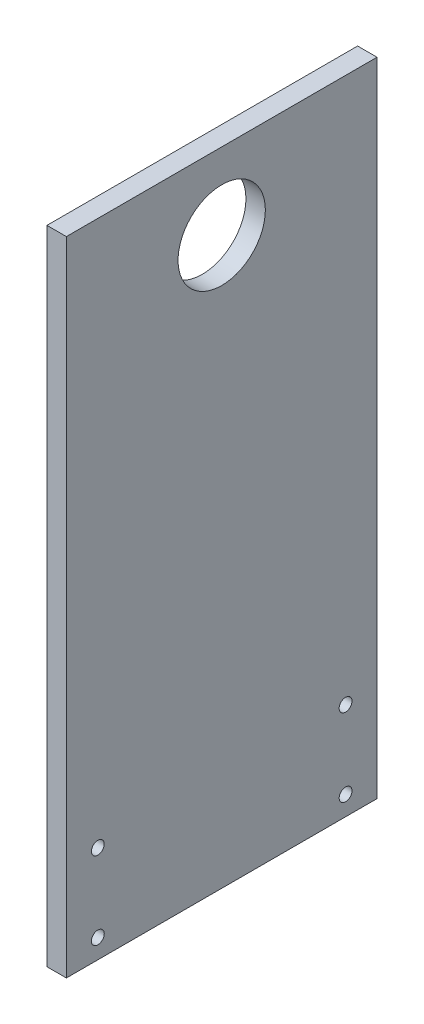
ISO-10303-21;
HEADER;
FILE_DESCRIPTION(('STEP AP214'),'2;1');
FILE_NAME('part.step','',(''),(''),'','','');
FILE_SCHEMA(('AUTOMOTIVE_DESIGN { 1 0 10303 214 1 1 1 1 }'));
ENDSEC;
DATA;
#1=APPLICATION_CONTEXT('core data for automotive mechanical design processes');
#2=APPLICATION_PROTOCOL_DEFINITION('international standard','automotive_design',2000,#1);
#3=PRODUCT_CONTEXT('',#1,'mechanical');
#4=PRODUCT('Part','Part','',(#3));
#5=PRODUCT_RELATED_PRODUCT_CATEGORY('part','',(#4));
#6=PRODUCT_DEFINITION_FORMATION('','',#4);
#7=PRODUCT_DEFINITION_CONTEXT('part definition',#1,'design');
#8=PRODUCT_DEFINITION('design','',#6,#7);
#9=PRODUCT_DEFINITION_SHAPE('','',#8);
#10=(LENGTH_UNIT() NAMED_UNIT(*) SI_UNIT(.MILLI.,.METRE.));
#11=(NAMED_UNIT(*) PLANE_ANGLE_UNIT() SI_UNIT($,.RADIAN.));
#12=(NAMED_UNIT(*) SI_UNIT($,.STERADIAN.) SOLID_ANGLE_UNIT());
#13=UNCERTAINTY_MEASURE_WITH_UNIT(LENGTH_MEASURE(1.E-05),#10,'distance_accuracy_value','');
#14=(GEOMETRIC_REPRESENTATION_CONTEXT(3) GLOBAL_UNCERTAINTY_ASSIGNED_CONTEXT((#13)) GLOBAL_UNIT_ASSIGNED_CONTEXT((#10,
#11,#12)) REPRESENTATION_CONTEXT('',''));
#15=CARTESIAN_POINT('',(0.,0.,0.));
#16=DIRECTION('',(0.,0.,1.));
#17=DIRECTION('',(1.,0.,0.));
#18=AXIS2_PLACEMENT_3D('',#15,#16,#17);
#19=CARTESIAN_POINT('',(6.35,0.,0.));
#20=DIRECTION('',(1.,0.,0.));
#21=DIRECTION('',(0.,0.,-1.));
#22=AXIS2_PLACEMENT_3D('',#19,#20,#21);
#23=PLANE('',#22);
#24=CARTESIAN_POINT('',(6.35,-73.25,-40.513));
#25=DIRECTION('',(1.,0.,0.));
#26=DIRECTION('',(0.,0.,-1.));
#27=AXIS2_PLACEMENT_3D('',#24,#25,#26);
#28=CIRCLE('',#27,2.1);
#29=CARTESIAN_POINT('',(6.35,-73.25,-42.613));
#30=VERTEX_POINT('',#29);
#31=EDGE_CURVE('E130',#30,#30,#28,.T.);
#32=ORIENTED_EDGE('',*,*,#31,.F.);
#33=EDGE_LOOP('',(#32));
#34=FACE_BOUND('',#33,.T.);
#35=CARTESIAN_POINT('',(6.35,-98.65,-40.513));
#36=DIRECTION('',(1.,0.,0.));
#37=DIRECTION('',(0.,0.,-1.));
#38=AXIS2_PLACEMENT_3D('',#35,#36,#37);
#39=CIRCLE('',#38,2.1);
#40=CARTESIAN_POINT('',(6.35,-98.65,-42.613));
#41=VERTEX_POINT('',#40);
#42=EDGE_CURVE('E118',#41,#41,#39,.T.);
#43=ORIENTED_EDGE('',*,*,#42,.F.);
#44=EDGE_LOOP('',(#43));
#45=FACE_BOUND('',#44,.T.);
#46=DIRECTION('',(0.,1.,0.));
#47=VECTOR('',#46,1.);
#48=CARTESIAN_POINT('',(6.35,105.,-50.8));
#49=LINE('',#48,#47);
#50=CARTESIAN_POINT('',(6.35,-105.,-50.8));
#51=VERTEX_POINT('',#50);
#52=CARTESIAN_POINT('',(6.35,105.,-50.8));
#53=VERTEX_POINT('',#52);
#54=EDGE_CURVE('E88',#51,#53,#49,.T.);
#55=ORIENTED_EDGE('',*,*,#54,.T.);
#56=DIRECTION('',(0.,0.,1.));
#57=VECTOR('',#56,1.);
#58=CARTESIAN_POINT('',(6.35,105.,50.8));
#59=LINE('',#58,#57);
#60=CARTESIAN_POINT('',(6.35,105.,50.8));
#61=VERTEX_POINT('',#60);
#62=EDGE_CURVE('E83',#53,#61,#59,.T.);
#63=ORIENTED_EDGE('',*,*,#62,.T.);
#64=DIRECTION('',(0.,-1.,0.));
#65=VECTOR('',#64,1.);
#66=CARTESIAN_POINT('',(6.35,105.,50.8));
#67=LINE('',#66,#65);
#68=CARTESIAN_POINT('',(6.35,-105.,50.8));
#69=VERTEX_POINT('',#68);
#70=EDGE_CURVE('E86',#61,#69,#67,.T.);
#71=ORIENTED_EDGE('',*,*,#70,.T.);
#72=DIRECTION('',(0.,0.,-1.));
#73=VECTOR('',#72,1.);
#74=CARTESIAN_POINT('',(6.35,-105.,50.8));
#75=LINE('',#74,#73);
#76=EDGE_CURVE('E53',#69,#51,#75,.T.);
#77=ORIENTED_EDGE('',*,*,#76,.T.);
#78=EDGE_LOOP('',(#55,#63,#71,#77));
#79=FACE_BOUND('',#78,.T.);
#80=CARTESIAN_POINT('',(6.35,-98.65,40.513));
#81=DIRECTION('',(1.,0.,0.));
#82=DIRECTION('',(0.,0.,-1.));
#83=AXIS2_PLACEMENT_3D('',#80,#81,#82);
#84=CIRCLE('',#83,2.1);
#85=CARTESIAN_POINT('',(6.35,-98.65,38.413));
#86=VERTEX_POINT('',#85);
#87=EDGE_CURVE('E103',#86,#86,#84,.T.);
#88=ORIENTED_EDGE('',*,*,#87,.F.);
#89=EDGE_LOOP('',(#88));
#90=FACE_BOUND('',#89,.T.);
#91=CARTESIAN_POINT('',(6.35,-73.25,40.513));
#92=DIRECTION('',(1.,0.,0.));
#93=DIRECTION('',(0.,0.,-1.));
#94=AXIS2_PLACEMENT_3D('',#91,#92,#93);
#95=CIRCLE('',#94,2.1);
#96=CARTESIAN_POINT('',(6.35,-73.25,38.413));
#97=VERTEX_POINT('',#96);
#98=EDGE_CURVE('E124',#97,#97,#95,.T.);
#99=ORIENTED_EDGE('',*,*,#98,.F.);
#100=EDGE_LOOP('',(#99));
#101=FACE_BOUND('',#100,.T.);
#102=CARTESIAN_POINT('',(6.35,80.,0.));
#103=DIRECTION('',(1.,0.,0.));
#104=DIRECTION('',(0.,0.,-1.));
#105=AXIS2_PLACEMENT_3D('',#102,#103,#104);
#106=CIRCLE('',#105,14.275);
#107=CARTESIAN_POINT('',(6.35,80.,-14.275));
#108=VERTEX_POINT('',#107);
#109=EDGE_CURVE('E136',#108,#108,#106,.T.);
#110=ORIENTED_EDGE('',*,*,#109,.F.);
#111=EDGE_LOOP('',(#110));
#112=FACE_BOUND('',#111,.T.);
#113=ADVANCED_FACE('F36',(#34,#45,#79,#90,#101,#112),#23,.T.);
#114=CARTESIAN_POINT('',(0.,0.,0.));
#115=DIRECTION('',(1.,0.,0.));
#116=DIRECTION('',(0.,0.,-1.));
#117=AXIS2_PLACEMENT_3D('',#114,#115,#116);
#118=PLANE('',#117);
#119=DIRECTION('',(0.,1.,0.));
#120=VECTOR('',#119,1.);
#121=CARTESIAN_POINT('',(0.,105.,-50.8));
#122=LINE('',#121,#120);
#123=CARTESIAN_POINT('',(0.,-105.,-50.8));
#124=VERTEX_POINT('',#123);
#125=CARTESIAN_POINT('',(0.,105.,-50.8));
#126=VERTEX_POINT('',#125);
#127=EDGE_CURVE('E100',#124,#126,#122,.T.);
#128=ORIENTED_EDGE('',*,*,#127,.F.);
#129=DIRECTION('',(0.,0.,-1.));
#130=VECTOR('',#129,1.);
#131=CARTESIAN_POINT('',(0.,-105.,50.8));
#132=LINE('',#131,#130);
#133=CARTESIAN_POINT('',(0.,-105.,50.8));
#134=VERTEX_POINT('',#133);
#135=EDGE_CURVE('E76',#134,#124,#132,.T.);
#136=ORIENTED_EDGE('',*,*,#135,.F.);
#137=DIRECTION('',(0.,-1.,0.));
#138=VECTOR('',#137,1.);
#139=CARTESIAN_POINT('',(0.,105.,50.8));
#140=LINE('',#139,#138);
#141=CARTESIAN_POINT('',(0.,105.,50.8));
#142=VERTEX_POINT('',#141);
#143=EDGE_CURVE('E70',#142,#134,#140,.T.);
#144=ORIENTED_EDGE('',*,*,#143,.F.);
#145=DIRECTION('',(0.,0.,1.));
#146=VECTOR('',#145,1.);
#147=CARTESIAN_POINT('',(0.,105.,50.8));
#148=LINE('',#147,#146);
#149=EDGE_CURVE('E92',#126,#142,#148,.T.);
#150=ORIENTED_EDGE('',*,*,#149,.F.);
#151=EDGE_LOOP('',(#128,#136,#144,#150));
#152=FACE_BOUND('',#151,.T.);
#153=CARTESIAN_POINT('',(0.,-98.65,40.513));
#154=DIRECTION('',(1.,0.,0.));
#155=DIRECTION('',(0.,0.,-1.));
#156=AXIS2_PLACEMENT_3D('',#153,#154,#155);
#157=CIRCLE('',#156,2.1);
#158=CARTESIAN_POINT('',(0.,-98.65,38.413));
#159=VERTEX_POINT('',#158);
#160=EDGE_CURVE('E115',#159,#159,#157,.T.);
#161=ORIENTED_EDGE('',*,*,#160,.T.);
#162=EDGE_LOOP('',(#161));
#163=FACE_BOUND('',#162,.T.);
#164=CARTESIAN_POINT('',(0.,-98.65,-40.513));
#165=DIRECTION('',(1.,0.,0.));
#166=DIRECTION('',(0.,0.,-1.));
#167=AXIS2_PLACEMENT_3D('',#164,#165,#166);
#168=CIRCLE('',#167,2.1);
#169=CARTESIAN_POINT('',(0.,-98.65,-42.613));
#170=VERTEX_POINT('',#169);
#171=EDGE_CURVE('E121',#170,#170,#168,.T.);
#172=ORIENTED_EDGE('',*,*,#171,.T.);
#173=EDGE_LOOP('',(#172));
#174=FACE_BOUND('',#173,.T.);
#175=CARTESIAN_POINT('',(0.,-73.25,40.513));
#176=DIRECTION('',(1.,0.,0.));
#177=DIRECTION('',(0.,0.,-1.));
#178=AXIS2_PLACEMENT_3D('',#175,#176,#177);
#179=CIRCLE('',#178,2.1);
#180=CARTESIAN_POINT('',(0.,-73.25,38.413));
#181=VERTEX_POINT('',#180);
#182=EDGE_CURVE('E127',#181,#181,#179,.T.);
#183=ORIENTED_EDGE('',*,*,#182,.T.);
#184=EDGE_LOOP('',(#183));
#185=FACE_BOUND('',#184,.T.);
#186=CARTESIAN_POINT('',(0.,-73.25,-40.513));
#187=DIRECTION('',(1.,0.,0.));
#188=DIRECTION('',(0.,0.,-1.));
#189=AXIS2_PLACEMENT_3D('',#186,#187,#188);
#190=CIRCLE('',#189,2.1);
#191=CARTESIAN_POINT('',(0.,-73.25,-42.613));
#192=VERTEX_POINT('',#191);
#193=EDGE_CURVE('E133',#192,#192,#190,.T.);
#194=ORIENTED_EDGE('',*,*,#193,.T.);
#195=EDGE_LOOP('',(#194));
#196=FACE_BOUND('',#195,.T.);
#197=CARTESIAN_POINT('',(0.,80.,0.));
#198=DIRECTION('',(1.,0.,0.));
#199=DIRECTION('',(0.,0.,-1.));
#200=AXIS2_PLACEMENT_3D('',#197,#198,#199);
#201=CIRCLE('',#200,14.275);
#202=CARTESIAN_POINT('',(0.,80.,-14.275));
#203=VERTEX_POINT('',#202);
#204=EDGE_CURVE('E139',#203,#203,#201,.T.);
#205=ORIENTED_EDGE('',*,*,#204,.T.);
#206=EDGE_LOOP('',(#205));
#207=FACE_BOUND('',#206,.T.);
#208=ADVANCED_FACE('F111',(#152,#163,#174,#185,#196,#207),#118,.F.);
#209=CARTESIAN_POINT('',(6.35,105.,-50.8));
#210=DIRECTION('',(0.,0.,1.));
#211=DIRECTION('',(0.,-1.,0.));
#212=AXIS2_PLACEMENT_3D('',#209,#210,#211);
#213=PLANE('',#212);
#214=ORIENTED_EDGE('',*,*,#127,.T.);
#215=DIRECTION('',(-1.,0.,0.));
#216=VECTOR('',#215,1.);
#217=CARTESIAN_POINT('',(6.35,105.,-50.8));
#218=LINE('',#217,#216);
#219=EDGE_CURVE('E11',#53,#126,#218,.T.);
#220=ORIENTED_EDGE('',*,*,#219,.F.);
#221=ORIENTED_EDGE('',*,*,#54,.F.);
#222=DIRECTION('',(-1.,0.,0.));
#223=VECTOR('',#222,1.);
#224=CARTESIAN_POINT('',(6.35,-105.,-50.8));
#225=LINE('',#224,#223);
#226=EDGE_CURVE('E96',#51,#124,#225,.T.);
#227=ORIENTED_EDGE('',*,*,#226,.T.);
#228=EDGE_LOOP('',(#214,#220,#221,#227));
#229=FACE_BOUND('',#228,.T.);
#230=ADVANCED_FACE('F38',(#229),#213,.F.);
#231=CARTESIAN_POINT('',(6.35,105.,50.8));
#232=DIRECTION('',(0.,-1.,0.));
#233=DIRECTION('',(0.,0.,-1.));
#234=AXIS2_PLACEMENT_3D('',#231,#232,#233);
#235=PLANE('',#234);
#236=ORIENTED_EDGE('',*,*,#149,.T.);
#237=DIRECTION('',(-1.,0.,0.));
#238=VECTOR('',#237,1.);
#239=CARTESIAN_POINT('',(6.35,105.,50.8));
#240=LINE('',#239,#238);
#241=EDGE_CURVE('E45',#61,#142,#240,.T.);
#242=ORIENTED_EDGE('',*,*,#241,.F.);
#243=ORIENTED_EDGE('',*,*,#62,.F.);
#244=ORIENTED_EDGE('',*,*,#219,.T.);
#245=EDGE_LOOP('',(#236,#242,#243,#244));
#246=FACE_BOUND('',#245,.T.);
#247=ADVANCED_FACE('F91',(#246),#235,.F.);
#248=CARTESIAN_POINT('',(6.35,105.,50.8));
#249=DIRECTION('',(0.,0.,-1.));
#250=DIRECTION('',(0.,1.,0.));
#251=AXIS2_PLACEMENT_3D('',#248,#249,#250);
#252=PLANE('',#251);
#253=ORIENTED_EDGE('',*,*,#143,.T.);
#254=DIRECTION('',(-1.,0.,0.));
#255=VECTOR('',#254,1.);
#256=CARTESIAN_POINT('',(6.35,-105.,50.8));
#257=LINE('',#256,#255);
#258=EDGE_CURVE('E93',#69,#134,#257,.T.);
#259=ORIENTED_EDGE('',*,*,#258,.F.);
#260=ORIENTED_EDGE('',*,*,#70,.F.);
#261=ORIENTED_EDGE('',*,*,#241,.T.);
#262=EDGE_LOOP('',(#253,#259,#260,#261));
#263=FACE_BOUND('',#262,.T.);
#264=ADVANCED_FACE('F94',(#263),#252,.F.);
#265=CARTESIAN_POINT('',(6.35,-105.,50.8));
#266=DIRECTION('',(0.,1.,0.));
#267=DIRECTION('',(0.,0.,1.));
#268=AXIS2_PLACEMENT_3D('',#265,#266,#267);
#269=PLANE('',#268);
#270=ORIENTED_EDGE('',*,*,#135,.T.);
#271=ORIENTED_EDGE('',*,*,#226,.F.);
#272=ORIENTED_EDGE('',*,*,#76,.F.);
#273=ORIENTED_EDGE('',*,*,#258,.T.);
#274=EDGE_LOOP('',(#270,#271,#272,#273));
#275=FACE_BOUND('',#274,.T.);
#276=ADVANCED_FACE('F108',(#275),#269,.F.);
#277=CARTESIAN_POINT('',(6.35,-98.65,40.513));
#278=DIRECTION('',(-1.,0.,0.));
#279=DIRECTION('',(0.,0.,1.));
#280=AXIS2_PLACEMENT_3D('',#277,#278,#279);
#281=CYLINDRICAL_SURFACE('',#280,2.1);
#282=ORIENTED_EDGE('',*,*,#87,.T.);
#283=EDGE_LOOP('',(#282));
#284=FACE_BOUND('',#283,.T.);
#285=ORIENTED_EDGE('',*,*,#160,.F.);
#286=EDGE_LOOP('',(#285));
#287=FACE_BOUND('',#286,.T.);
#288=ADVANCED_FACE('F158',(#284,#287),#281,.F.);
#289=CARTESIAN_POINT('',(6.35,-98.65,-40.513));
#290=DIRECTION('',(-1.,0.,0.));
#291=DIRECTION('',(0.,0.,1.));
#292=AXIS2_PLACEMENT_3D('',#289,#290,#291);
#293=CYLINDRICAL_SURFACE('',#292,2.1);
#294=ORIENTED_EDGE('',*,*,#42,.T.);
#295=EDGE_LOOP('',(#294));
#296=FACE_BOUND('',#295,.T.);
#297=ORIENTED_EDGE('',*,*,#171,.F.);
#298=EDGE_LOOP('',(#297));
#299=FACE_BOUND('',#298,.T.);
#300=ADVANCED_FACE('F204',(#296,#299),#293,.F.);
#301=CARTESIAN_POINT('',(6.35,-73.25,40.513));
#302=DIRECTION('',(-1.,0.,0.));
#303=DIRECTION('',(0.,0.,1.));
#304=AXIS2_PLACEMENT_3D('',#301,#302,#303);
#305=CYLINDRICAL_SURFACE('',#304,2.1);
#306=ORIENTED_EDGE('',*,*,#98,.T.);
#307=EDGE_LOOP('',(#306));
#308=FACE_BOUND('',#307,.T.);
#309=ORIENTED_EDGE('',*,*,#182,.F.);
#310=EDGE_LOOP('',(#309));
#311=FACE_BOUND('',#310,.T.);
#312=ADVANCED_FACE('F212',(#308,#311),#305,.F.);
#313=CARTESIAN_POINT('',(6.35,-73.25,-40.513));
#314=DIRECTION('',(-1.,0.,0.));
#315=DIRECTION('',(0.,0.,1.));
#316=AXIS2_PLACEMENT_3D('',#313,#314,#315);
#317=CYLINDRICAL_SURFACE('',#316,2.1);
#318=ORIENTED_EDGE('',*,*,#31,.T.);
#319=EDGE_LOOP('',(#318));
#320=FACE_BOUND('',#319,.T.);
#321=ORIENTED_EDGE('',*,*,#193,.F.);
#322=EDGE_LOOP('',(#321));
#323=FACE_BOUND('',#322,.T.);
#324=ADVANCED_FACE('F220',(#320,#323),#317,.F.);
#325=CARTESIAN_POINT('',(6.35,80.,0.));
#326=DIRECTION('',(-1.,0.,0.));
#327=DIRECTION('',(0.,0.,1.));
#328=AXIS2_PLACEMENT_3D('',#325,#326,#327);
#329=CYLINDRICAL_SURFACE('',#328,14.275);
#330=ORIENTED_EDGE('',*,*,#109,.T.);
#331=EDGE_LOOP('',(#330));
#332=FACE_BOUND('',#331,.T.);
#333=ORIENTED_EDGE('',*,*,#204,.F.);
#334=EDGE_LOOP('',(#333));
#335=FACE_BOUND('',#334,.T.);
#336=ADVANCED_FACE('F145',(#332,#335),#329,.F.);
#337=CLOSED_SHELL('',(#113,#208,#230,#247,#264,#276,#288,#300,#312,#324,#336));
#338=MANIFOLD_SOLID_BREP('B2',#337);
#339=ADVANCED_BREP_SHAPE_REPRESENTATION('',(#18,#338),#14);
#340=SHAPE_DEFINITION_REPRESENTATION(#9,#339);
ENDSEC;
END-ISO-10303-21;
